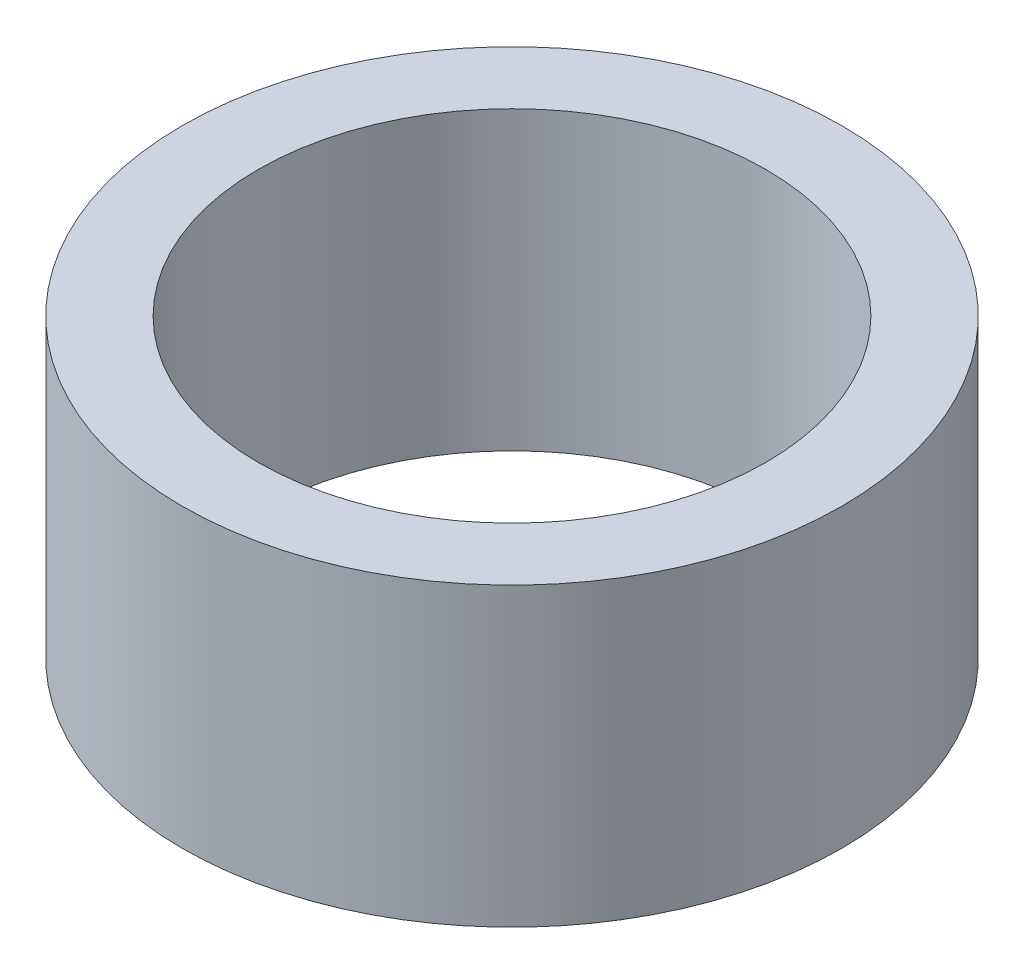
ISO-10303-21;
HEADER;
FILE_DESCRIPTION(('STEP AP214'),'2;1');
FILE_NAME('part.step','',(''),(''),'','','');
FILE_SCHEMA(('AUTOMOTIVE_DESIGN { 1 0 10303 214 1 1 1 1 }'));
ENDSEC;
DATA;
#1=APPLICATION_CONTEXT('core data for automotive mechanical design processes');
#2=APPLICATION_PROTOCOL_DEFINITION('international standard','automotive_design',2000,#1);
#3=PRODUCT_CONTEXT('',#1,'mechanical');
#4=PRODUCT('Part','Part','',(#3));
#5=PRODUCT_RELATED_PRODUCT_CATEGORY('part','',(#4));
#6=PRODUCT_DEFINITION_FORMATION('','',#4);
#7=PRODUCT_DEFINITION_CONTEXT('part definition',#1,'design');
#8=PRODUCT_DEFINITION('design','',#6,#7);
#9=PRODUCT_DEFINITION_SHAPE('','',#8);
#10=(LENGTH_UNIT() NAMED_UNIT(*) SI_UNIT(.MILLI.,.METRE.));
#11=(NAMED_UNIT(*) PLANE_ANGLE_UNIT() SI_UNIT($,.RADIAN.));
#12=(NAMED_UNIT(*) SI_UNIT($,.STERADIAN.) SOLID_ANGLE_UNIT());
#13=UNCERTAINTY_MEASURE_WITH_UNIT(LENGTH_MEASURE(1.E-05),#10,'distance_accuracy_value','');
#14=(GEOMETRIC_REPRESENTATION_CONTEXT(3) GLOBAL_UNCERTAINTY_ASSIGNED_CONTEXT((#13)) GLOBAL_UNIT_ASSIGNED_CONTEXT((#10,
#11,#12)) REPRESENTATION_CONTEXT('',''));
#15=CARTESIAN_POINT('',(0.,0.,0.));
#16=DIRECTION('',(0.,0.,1.));
#17=DIRECTION('',(1.,0.,0.));
#18=AXIS2_PLACEMENT_3D('',#15,#16,#17);
#19=CARTESIAN_POINT('',(0.,8.5598,0.));
#20=DIRECTION('',(0.,-1.,0.));
#21=DIRECTION('',(0.,0.,-1.));
#22=AXIS2_PLACEMENT_3D('',#19,#20,#21);
#23=CYLINDRICAL_SURFACE('',#22,7.33234841870825);
#24=CARTESIAN_POINT('',(0.,8.5598,0.));
#25=DIRECTION('',(0.,1.,0.));
#26=DIRECTION('',(0.,0.,1.));
#27=AXIS2_PLACEMENT_3D('',#24,#25,#26);
#28=CIRCLE('',#27,7.33234841870825);
#29=CARTESIAN_POINT('',(0.,8.5598,7.33234841870825));
#30=VERTEX_POINT('',#29);
#31=EDGE_CURVE('E40',#30,#30,#28,.T.);
#32=ORIENTED_EDGE('',*,*,#31,.T.);
#33=EDGE_LOOP('',(#32));
#34=FACE_BOUND('',#33,.T.);
#35=CARTESIAN_POINT('',(0.,0.,0.));
#36=DIRECTION('',(0.,1.,0.));
#37=DIRECTION('',(0.,0.,1.));
#38=AXIS2_PLACEMENT_3D('',#35,#36,#37);
#39=CIRCLE('',#38,7.33234841870825);
#40=CARTESIAN_POINT('',(0.,0.,7.33234841870825));
#41=VERTEX_POINT('',#40);
#42=EDGE_CURVE('E46',#41,#41,#39,.T.);
#43=ORIENTED_EDGE('',*,*,#42,.F.);
#44=EDGE_LOOP('',(#43));
#45=FACE_BOUND('',#44,.T.);
#46=ADVANCED_FACE('F33',(#34,#45),#23,.F.);
#47=CARTESIAN_POINT('',(0.,8.5598,0.));
#48=DIRECTION('',(0.,-1.,0.));
#49=DIRECTION('',(0.,0.,-1.));
#50=AXIS2_PLACEMENT_3D('',#47,#48,#49);
#51=CYLINDRICAL_SURFACE('',#50,9.525);
#52=CARTESIAN_POINT('',(0.,8.5598,0.));
#53=DIRECTION('',(0.,1.,0.));
#54=DIRECTION('',(0.,0.,1.));
#55=AXIS2_PLACEMENT_3D('',#52,#53,#54);
#56=CIRCLE('',#55,9.525);
#57=CARTESIAN_POINT('',(0.,8.5598,9.525));
#58=VERTEX_POINT('',#57);
#59=EDGE_CURVE('E10',#58,#58,#56,.T.);
#60=ORIENTED_EDGE('',*,*,#59,.F.);
#61=EDGE_LOOP('',(#60));
#62=FACE_BOUND('',#61,.T.);
#63=CARTESIAN_POINT('',(0.,0.,0.));
#64=DIRECTION('',(0.,1.,0.));
#65=DIRECTION('',(0.,0.,1.));
#66=AXIS2_PLACEMENT_3D('',#63,#64,#65);
#67=CIRCLE('',#66,9.525);
#68=CARTESIAN_POINT('',(0.,0.,9.525));
#69=VERTEX_POINT('',#68);
#70=EDGE_CURVE('E36',#69,#69,#67,.T.);
#71=ORIENTED_EDGE('',*,*,#70,.T.);
#72=EDGE_LOOP('',(#71));
#73=FACE_BOUND('',#72,.T.);
#74=ADVANCED_FACE('F53',(#62,#73),#51,.T.);
#75=CARTESIAN_POINT('',(0.,8.5598,0.));
#76=DIRECTION('',(0.,1.,0.));
#77=DIRECTION('',(0.,0.,1.));
#78=AXIS2_PLACEMENT_3D('',#75,#76,#77);
#79=PLANE('',#78);
#80=ORIENTED_EDGE('',*,*,#31,.F.);
#81=EDGE_LOOP('',(#80));
#82=FACE_BOUND('',#81,.T.);
#83=ORIENTED_EDGE('',*,*,#59,.T.);
#84=EDGE_LOOP('',(#83));
#85=FACE_BOUND('',#84,.T.);
#86=ADVANCED_FACE('F57',(#82,#85),#79,.T.);
#87=CARTESIAN_POINT('',(0.,0.,0.));
#88=DIRECTION('',(0.,1.,0.));
#89=DIRECTION('',(0.,0.,1.));
#90=AXIS2_PLACEMENT_3D('',#87,#88,#89);
#91=PLANE('',#90);
#92=ORIENTED_EDGE('',*,*,#42,.T.);
#93=EDGE_LOOP('',(#92));
#94=FACE_BOUND('',#93,.T.);
#95=ORIENTED_EDGE('',*,*,#70,.F.);
#96=EDGE_LOOP('',(#95));
#97=FACE_BOUND('',#96,.T.);
#98=ADVANCED_FACE('F55',(#94,#97),#91,.F.);
#99=CLOSED_SHELL('',(#46,#74,#86,#98));
#100=MANIFOLD_SOLID_BREP('B2',#99);
#101=ADVANCED_BREP_SHAPE_REPRESENTATION('',(#18,#100),#14);
#102=SHAPE_DEFINITION_REPRESENTATION(#9,#101);
ENDSEC;
END-ISO-10303-21;
